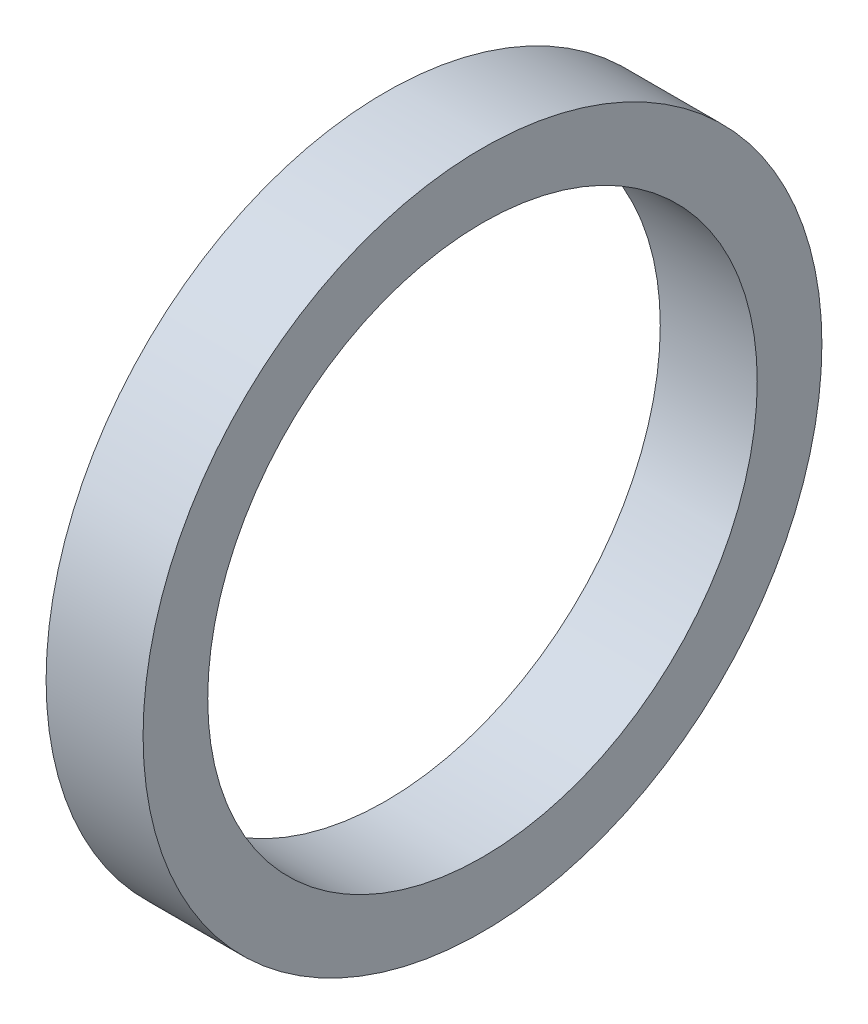
ISO-10303-21;
HEADER;
FILE_DESCRIPTION(('STEP AP214'),'2;1');
FILE_NAME('part.step','',(''),(''),'','','');
FILE_SCHEMA(('AUTOMOTIVE_DESIGN { 1 0 10303 214 1 1 1 1 }'));
ENDSEC;
DATA;
#1=APPLICATION_CONTEXT('core data for automotive mechanical design processes');
#2=APPLICATION_PROTOCOL_DEFINITION('international standard','automotive_design',2000,#1);
#3=PRODUCT_CONTEXT('',#1,'mechanical');
#4=PRODUCT('Part','Part','',(#3));
#5=PRODUCT_RELATED_PRODUCT_CATEGORY('part','',(#4));
#6=PRODUCT_DEFINITION_FORMATION('','',#4);
#7=PRODUCT_DEFINITION_CONTEXT('part definition',#1,'design');
#8=PRODUCT_DEFINITION('design','',#6,#7);
#9=PRODUCT_DEFINITION_SHAPE('','',#8);
#10=(LENGTH_UNIT() NAMED_UNIT(*) SI_UNIT(.MILLI.,.METRE.));
#11=(NAMED_UNIT(*) PLANE_ANGLE_UNIT() SI_UNIT($,.RADIAN.));
#12=(NAMED_UNIT(*) SI_UNIT($,.STERADIAN.) SOLID_ANGLE_UNIT());
#13=UNCERTAINTY_MEASURE_WITH_UNIT(LENGTH_MEASURE(1.E-05),#10,'distance_accuracy_value','');
#14=(GEOMETRIC_REPRESENTATION_CONTEXT(3) GLOBAL_UNCERTAINTY_ASSIGNED_CONTEXT((#13)) GLOBAL_UNIT_ASSIGNED_CONTEXT((#10,
#11,#12)) REPRESENTATION_CONTEXT('',''));
#15=CARTESIAN_POINT('',(0.,0.,0.));
#16=DIRECTION('',(0.,0.,1.));
#17=DIRECTION('',(1.,0.,0.));
#18=AXIS2_PLACEMENT_3D('',#15,#16,#17);
#19=CARTESIAN_POINT('',(4.7625,0.,0.));
#20=DIRECTION('',(1.,0.,0.));
#21=DIRECTION('',(0.,0.,-1.));
#22=AXIS2_PLACEMENT_3D('',#19,#20,#21);
#23=PLANE('',#22);
#24=CARTESIAN_POINT('',(4.7625,0.,0.));
#25=DIRECTION('',(1.,0.,0.));
#26=DIRECTION('',(0.,0.,-1.));
#27=AXIS2_PLACEMENT_3D('',#24,#25,#26);
#28=CIRCLE('',#27,33.3375);
#29=CARTESIAN_POINT('',(4.7625,0.,33.3375));
#30=VERTEX_POINT('',#29);
#31=EDGE_CURVE('E10',#30,#30,#28,.T.);
#32=ORIENTED_EDGE('',*,*,#31,.T.);
#33=EDGE_LOOP('',(#32));
#34=FACE_BOUND('',#33,.T.);
#35=CARTESIAN_POINT('',(4.7625,0.,0.));
#36=DIRECTION('',(1.,0.,0.));
#37=DIRECTION('',(0.,0.,-1.));
#38=AXIS2_PLACEMENT_3D('',#35,#36,#37);
#39=CIRCLE('',#38,26.9875);
#40=CARTESIAN_POINT('',(4.7625,0.,26.9875));
#41=VERTEX_POINT('',#40);
#42=EDGE_CURVE('E42',#41,#41,#39,.T.);
#43=ORIENTED_EDGE('',*,*,#42,.F.);
#44=EDGE_LOOP('',(#43));
#45=FACE_BOUND('',#44,.T.);
#46=ADVANCED_FACE('F31',(#34,#45),#23,.T.);
#47=CARTESIAN_POINT('',(-4.7625,0.,0.));
#48=DIRECTION('',(1.,0.,0.));
#49=DIRECTION('',(0.,0.,-1.));
#50=AXIS2_PLACEMENT_3D('',#47,#48,#49);
#51=PLANE('',#50);
#52=CARTESIAN_POINT('',(-4.7625,0.,0.));
#53=DIRECTION('',(1.,0.,0.));
#54=DIRECTION('',(0.,0.,-1.));
#55=AXIS2_PLACEMENT_3D('',#52,#53,#54);
#56=CIRCLE('',#55,33.3375);
#57=CARTESIAN_POINT('',(-4.7625,0.,33.3375));
#58=VERTEX_POINT('',#57);
#59=EDGE_CURVE('E35',#58,#58,#56,.T.);
#60=ORIENTED_EDGE('',*,*,#59,.F.);
#61=EDGE_LOOP('',(#60));
#62=FACE_BOUND('',#61,.T.);
#63=CARTESIAN_POINT('',(-4.7625,0.,0.));
#64=DIRECTION('',(1.,0.,0.));
#65=DIRECTION('',(0.,0.,-1.));
#66=AXIS2_PLACEMENT_3D('',#63,#64,#65);
#67=CIRCLE('',#66,26.9875);
#68=CARTESIAN_POINT('',(-4.7625,0.,26.9875));
#69=VERTEX_POINT('',#68);
#70=EDGE_CURVE('E44',#69,#69,#67,.T.);
#71=ORIENTED_EDGE('',*,*,#70,.T.);
#72=EDGE_LOOP('',(#71));
#73=FACE_BOUND('',#72,.T.);
#74=ADVANCED_FACE('F54',(#62,#73),#51,.F.);
#75=CARTESIAN_POINT('',(4.7625,0.,0.));
#76=DIRECTION('',(-1.,0.,0.));
#77=DIRECTION('',(0.,0.,1.));
#78=AXIS2_PLACEMENT_3D('',#75,#76,#77);
#79=CYLINDRICAL_SURFACE('',#78,33.3375);
#80=CARTESIAN_POINT('',(4.7625,0.,33.3375));
#81=CARTESIAN_POINT('',(4.66328125,0.,33.3375));
#82=CARTESIAN_POINT('',(4.5640625,0.,33.3375));
#83=CARTESIAN_POINT('',(4.365625,0.,33.3375));
#84=CARTESIAN_POINT('',(4.26640625,0.,33.3375));
#85=CARTESIAN_POINT('',(4.06796875,0.,33.3375));
#86=CARTESIAN_POINT('',(3.96875,0.,33.3375));
#87=CARTESIAN_POINT('',(3.7703125,0.,33.3375));
#88=CARTESIAN_POINT('',(3.67109375,0.,33.3375));
#89=CARTESIAN_POINT('',(3.47265625,0.,33.3375));
#90=CARTESIAN_POINT('',(3.3734375,0.,33.3375));
#91=CARTESIAN_POINT('',(3.175,0.,33.3375));
#92=CARTESIAN_POINT('',(3.07578125,0.,33.3375));
#93=CARTESIAN_POINT('',(2.87734375,0.,33.3375));
#94=CARTESIAN_POINT('',(2.778125,0.,33.3375));
#95=CARTESIAN_POINT('',(2.5796875,0.,33.3375));
#96=CARTESIAN_POINT('',(2.48046875,0.,33.3375));
#97=CARTESIAN_POINT('',(2.28203125,0.,33.3375));
#98=CARTESIAN_POINT('',(2.1828125,0.,33.3375));
#99=CARTESIAN_POINT('',(1.984375,0.,33.3375));
#100=CARTESIAN_POINT('',(1.88515625,0.,33.3375));
#101=CARTESIAN_POINT('',(1.68671875,0.,33.3375));
#102=CARTESIAN_POINT('',(1.5875,0.,33.3375));
#103=CARTESIAN_POINT('',(1.3890625,0.,33.3375));
#104=CARTESIAN_POINT('',(1.28984375,0.,33.3375));
#105=CARTESIAN_POINT('',(1.09140625,0.,33.3375));
#106=CARTESIAN_POINT('',(0.992187499999999,0.,33.3375));
#107=CARTESIAN_POINT('',(0.793749999999999,0.,33.3375));
#108=CARTESIAN_POINT('',(0.694531249999999,0.,33.3375));
#109=CARTESIAN_POINT('',(0.496093749999999,0.,33.3375));
#110=CARTESIAN_POINT('',(0.396874999999999,0.,33.3375));
#111=CARTESIAN_POINT('',(0.198437499999999,0.,33.3375));
#112=CARTESIAN_POINT('',(0.0992187499999992,0.,33.3375));
#113=CARTESIAN_POINT('',(-0.0992187500000009,0.,33.3375));
#114=CARTESIAN_POINT('',(-0.198437500000001,0.,33.3375));
#115=CARTESIAN_POINT('',(-0.396875000000001,0.,33.3375));
#116=CARTESIAN_POINT('',(-0.496093750000001,0.,33.3375));
#117=CARTESIAN_POINT('',(-0.694531250000001,0.,33.3375));
#118=CARTESIAN_POINT('',(-0.793750000000001,0.,33.3375));
#119=CARTESIAN_POINT('',(-0.992187500000002,0.,33.3375));
#120=CARTESIAN_POINT('',(-1.09140625,0.,33.3375));
#121=CARTESIAN_POINT('',(-1.28984375,0.,33.3375));
#122=CARTESIAN_POINT('',(-1.3890625,0.,33.3375));
#123=CARTESIAN_POINT('',(-1.5875,0.,33.3375));
#124=CARTESIAN_POINT('',(-1.68671875,0.,33.3375));
#125=CARTESIAN_POINT('',(-1.88515625,0.,33.3375));
#126=CARTESIAN_POINT('',(-1.984375,0.,33.3375));
#127=CARTESIAN_POINT('',(-2.1828125,0.,33.3375));
#128=CARTESIAN_POINT('',(-2.28203125,0.,33.3375));
#129=CARTESIAN_POINT('',(-2.48046875,0.,33.3375));
#130=CARTESIAN_POINT('',(-2.5796875,0.,33.3375));
#131=CARTESIAN_POINT('',(-2.778125,0.,33.3375));
#132=CARTESIAN_POINT('',(-2.87734375,0.,33.3375));
#133=CARTESIAN_POINT('',(-3.07578125,0.,33.3375));
#134=CARTESIAN_POINT('',(-3.175,0.,33.3375));
#135=CARTESIAN_POINT('',(-3.3734375,0.,33.3375));
#136=CARTESIAN_POINT('',(-3.47265625,0.,33.3375));
#137=CARTESIAN_POINT('',(-3.67109375,0.,33.3375));
#138=CARTESIAN_POINT('',(-3.7703125,0.,33.3375));
#139=CARTESIAN_POINT('',(-3.96875,0.,33.3375));
#140=CARTESIAN_POINT('',(-4.06796875,0.,33.3375));
#141=CARTESIAN_POINT('',(-4.26640625,0.,33.3375));
#142=CARTESIAN_POINT('',(-4.365625,0.,33.3375));
#143=CARTESIAN_POINT('',(-4.5640625,0.,33.3375));
#144=CARTESIAN_POINT('',(-4.66328125,0.,33.3375));
#145=CARTESIAN_POINT('',(-4.7625,0.,33.3375));
#146=B_SPLINE_CURVE_WITH_KNOTS('',3,(#80,#81,#82,#83,#84,#85,#86,#87,#88,#89,#90,#91,#92,#93,
#94,#95,#96,#97,#98,#99,#100,#101,#102,#103,#104,#105,#106,#107,#108,#109,#110,#111,#112,#113,
#114,#115,#116,#117,#118,#119,#120,#121,#122,#123,#124,#125,#126,#127,#128,#129,#130,#131,#132,
#133,#134,#135,#136,#137,#138,#139,#140,#141,#142,#143,#144,#145),.UNSPECIFIED.,.F.,.F.,(4,2,2,
2,2,2,2,2,2,2,2,2,2,2,2,2,2,2,2,2,2,2,2,2,2,2,2,2,2,2,2,2,4),(0.,0.297656249999999,
0.595312499999999,0.89296875,1.190625,1.48828125,1.7859375,2.08359375,2.38125,2.67890625,
2.9765625,3.27421875,3.571875,3.86953125,4.1671875,4.46484375,4.7625,5.06015625,5.3578125,
5.65546875,5.953125,6.25078125,6.5484375,6.84609375,7.14375,7.44140625,7.7390625,8.03671875,
8.334375,8.63203125,8.9296875,9.22734375,9.525),.UNSPECIFIED.);
#147=EDGE_CURVE('BSEAM33',#30,#58,#146,.T.);
#148=ORIENTED_EDGE('',*,*,#31,.F.);
#149=ORIENTED_EDGE('',*,*,#59,.T.);
#150=ORIENTED_EDGE('',*,*,#147,.T.);
#151=ORIENTED_EDGE('',*,*,#147,.F.);
#152=EDGE_LOOP('',(#148,#150,#149,#151));
#153=FACE_BOUND('',#152,.T.);
#154=ADVANCED_FACE('F33',(#153),#79,.T.);
#155=CARTESIAN_POINT('',(4.7625,0.,0.));
#156=DIRECTION('',(-1.,0.,0.));
#157=DIRECTION('',(0.,0.,1.));
#158=AXIS2_PLACEMENT_3D('',#155,#156,#157);
#159=CYLINDRICAL_SURFACE('',#158,26.9875);
#160=CARTESIAN_POINT('',(4.7625,0.,26.9875));
#161=CARTESIAN_POINT('',(4.66328125,0.,26.9875));
#162=CARTESIAN_POINT('',(4.5640625,0.,26.9875));
#163=CARTESIAN_POINT('',(4.365625,0.,26.9875));
#164=CARTESIAN_POINT('',(4.26640625,0.,26.9875));
#165=CARTESIAN_POINT('',(4.06796875,0.,26.9875));
#166=CARTESIAN_POINT('',(3.96875,0.,26.9875));
#167=CARTESIAN_POINT('',(3.7703125,0.,26.9875));
#168=CARTESIAN_POINT('',(3.67109375,0.,26.9875));
#169=CARTESIAN_POINT('',(3.47265625,0.,26.9875));
#170=CARTESIAN_POINT('',(3.3734375,0.,26.9875));
#171=CARTESIAN_POINT('',(3.175,0.,26.9875));
#172=CARTESIAN_POINT('',(3.07578125,0.,26.9875));
#173=CARTESIAN_POINT('',(2.87734375,0.,26.9875));
#174=CARTESIAN_POINT('',(2.778125,0.,26.9875));
#175=CARTESIAN_POINT('',(2.5796875,0.,26.9875));
#176=CARTESIAN_POINT('',(2.48046875,0.,26.9875));
#177=CARTESIAN_POINT('',(2.28203125,0.,26.9875));
#178=CARTESIAN_POINT('',(2.1828125,0.,26.9875));
#179=CARTESIAN_POINT('',(1.984375,0.,26.9875));
#180=CARTESIAN_POINT('',(1.88515625,0.,26.9875));
#181=CARTESIAN_POINT('',(1.68671875,0.,26.9875));
#182=CARTESIAN_POINT('',(1.5875,0.,26.9875));
#183=CARTESIAN_POINT('',(1.3890625,0.,26.9875));
#184=CARTESIAN_POINT('',(1.28984375,0.,26.9875));
#185=CARTESIAN_POINT('',(1.09140625,0.,26.9875));
#186=CARTESIAN_POINT('',(0.992187499999999,0.,26.9875));
#187=CARTESIAN_POINT('',(0.79375,0.,26.9875));
#188=CARTESIAN_POINT('',(0.69453125,0.,26.9875));
#189=CARTESIAN_POINT('',(0.49609375,0.,26.9875));
#190=CARTESIAN_POINT('',(0.396875,0.,26.9875));
#191=CARTESIAN_POINT('',(0.1984375,0.,26.9875));
#192=CARTESIAN_POINT('',(0.0992187500000001,0.,26.9875));
#193=CARTESIAN_POINT('',(-0.0992187500000001,0.,26.9875));
#194=CARTESIAN_POINT('',(-0.1984375,0.,26.9875));
#195=CARTESIAN_POINT('',(-0.396875,0.,26.9875));
#196=CARTESIAN_POINT('',(-0.49609375,0.,26.9875));
#197=CARTESIAN_POINT('',(-0.69453125,0.,26.9875));
#198=CARTESIAN_POINT('',(-0.793750000000001,0.,26.9875));
#199=CARTESIAN_POINT('',(-0.992187500000001,0.,26.9875));
#200=CARTESIAN_POINT('',(-1.09140625,0.,26.9875));
#201=CARTESIAN_POINT('',(-1.28984375,0.,26.9875));
#202=CARTESIAN_POINT('',(-1.3890625,0.,26.9875));
#203=CARTESIAN_POINT('',(-1.5875,0.,26.9875));
#204=CARTESIAN_POINT('',(-1.68671875,0.,26.9875));
#205=CARTESIAN_POINT('',(-1.88515625,0.,26.9875));
#206=CARTESIAN_POINT('',(-1.984375,0.,26.9875));
#207=CARTESIAN_POINT('',(-2.1828125,0.,26.9875));
#208=CARTESIAN_POINT('',(-2.28203125,0.,26.9875));
#209=CARTESIAN_POINT('',(-2.48046875,0.,26.9875));
#210=CARTESIAN_POINT('',(-2.5796875,0.,26.9875));
#211=CARTESIAN_POINT('',(-2.778125,0.,26.9875));
#212=CARTESIAN_POINT('',(-2.87734375,0.,26.9875));
#213=CARTESIAN_POINT('',(-3.07578125,0.,26.9875));
#214=CARTESIAN_POINT('',(-3.175,0.,26.9875));
#215=CARTESIAN_POINT('',(-3.3734375,0.,26.9875));
#216=CARTESIAN_POINT('',(-3.47265625,0.,26.9875));
#217=CARTESIAN_POINT('',(-3.67109375,0.,26.9875));
#218=CARTESIAN_POINT('',(-3.7703125,0.,26.9875));
#219=CARTESIAN_POINT('',(-3.96875,0.,26.9875));
#220=CARTESIAN_POINT('',(-4.06796875,0.,26.9875));
#221=CARTESIAN_POINT('',(-4.26640625,0.,26.9875));
#222=CARTESIAN_POINT('',(-4.365625,0.,26.9875));
#223=CARTESIAN_POINT('',(-4.5640625,0.,26.9875));
#224=CARTESIAN_POINT('',(-4.66328125,0.,26.9875));
#225=CARTESIAN_POINT('',(-4.7625,0.,26.9875));
#226=B_SPLINE_CURVE_WITH_KNOTS('',3,(#160,#161,#162,#163,#164,#165,#166,#167,#168,#169,#170,
#171,#172,#173,#174,#175,#176,#177,#178,#179,#180,#181,#182,#183,#184,#185,#186,#187,#188,#189,
#190,#191,#192,#193,#194,#195,#196,#197,#198,#199,#200,#201,#202,#203,#204,#205,#206,#207,#208,
#209,#210,#211,#212,#213,#214,#215,#216,#217,#218,#219,#220,#221,#222,#223,#224,#225),
.UNSPECIFIED.,.F.,.F.,(4,2,2,2,2,2,2,2,2,2,2,2,2,2,2,2,2,2,2,2,2,2,2,2,2,2,2,2,2,2,2,2,4),(0.,
0.29765625,0.5953125,0.892968750000001,1.190625,1.48828125,1.7859375,2.08359375,2.38125,
2.67890625,2.9765625,3.27421875,3.571875,3.86953125,4.1671875,4.46484375,4.7625,5.06015625,
5.3578125,5.65546875,5.953125,6.25078125,6.5484375,6.84609375,7.14375,7.44140625,7.7390625,
8.03671875,8.334375,8.63203125,8.9296875,9.22734375,9.525),.UNSPECIFIED.);
#227=EDGE_CURVE('BSEAM50',#41,#69,#226,.T.);
#228=ORIENTED_EDGE('',*,*,#42,.T.);
#229=ORIENTED_EDGE('',*,*,#70,.F.);
#230=ORIENTED_EDGE('',*,*,#227,.T.);
#231=ORIENTED_EDGE('',*,*,#227,.F.);
#232=EDGE_LOOP('',(#228,#230,#229,#231));
#233=FACE_BOUND('',#232,.T.);
#234=ADVANCED_FACE('F50',(#233),#159,.F.);
#235=CLOSED_SHELL('',(#46,#74,#154,#234));
#236=MANIFOLD_SOLID_BREP('B2',#235);
#237=ADVANCED_BREP_SHAPE_REPRESENTATION('',(#18,#236),#14);
#238=SHAPE_DEFINITION_REPRESENTATION(#9,#237);
ENDSEC;
END-ISO-10303-21;
